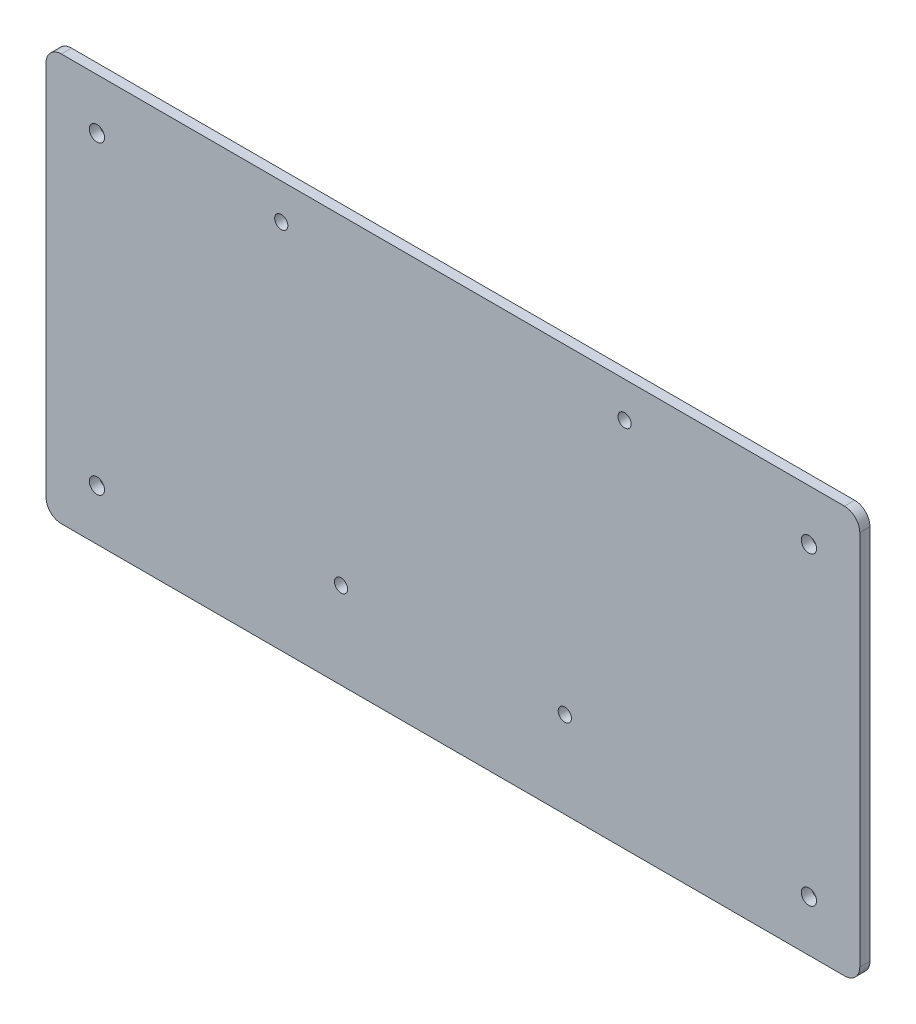
ISO-10303-21;
HEADER;
FILE_DESCRIPTION(('STEP AP214'),'2;1');
FILE_NAME('part.step','',(''),(''),'','','');
FILE_SCHEMA(('AUTOMOTIVE_DESIGN { 1 0 10303 214 1 1 1 1 }'));
ENDSEC;
DATA;
#1=APPLICATION_CONTEXT('core data for automotive mechanical design processes');
#2=APPLICATION_PROTOCOL_DEFINITION('international standard','automotive_design',2000,#1);
#3=PRODUCT_CONTEXT('',#1,'mechanical');
#4=PRODUCT('Part','Part','',(#3));
#5=PRODUCT_RELATED_PRODUCT_CATEGORY('part','',(#4));
#6=PRODUCT_DEFINITION_FORMATION('','',#4);
#7=PRODUCT_DEFINITION_CONTEXT('part definition',#1,'design');
#8=PRODUCT_DEFINITION('design','',#6,#7);
#9=PRODUCT_DEFINITION_SHAPE('','',#8);
#10=(LENGTH_UNIT() NAMED_UNIT(*) SI_UNIT(.MILLI.,.METRE.));
#11=(NAMED_UNIT(*) PLANE_ANGLE_UNIT() SI_UNIT($,.RADIAN.));
#12=(NAMED_UNIT(*) SI_UNIT($,.STERADIAN.) SOLID_ANGLE_UNIT());
#13=UNCERTAINTY_MEASURE_WITH_UNIT(LENGTH_MEASURE(1.E-05),#10,'distance_accuracy_value','');
#14=(GEOMETRIC_REPRESENTATION_CONTEXT(3) GLOBAL_UNCERTAINTY_ASSIGNED_CONTEXT((#13)) GLOBAL_UNIT_ASSIGNED_CONTEXT((#10,
#11,#12)) REPRESENTATION_CONTEXT('',''));
#15=CARTESIAN_POINT('',(0.,0.,0.));
#16=DIRECTION('',(0.,0.,1.));
#17=DIRECTION('',(1.,0.,0.));
#18=AXIS2_PLACEMENT_3D('',#15,#16,#17);
#19=CARTESIAN_POINT('',(-80.,-40.,2.));
#20=DIRECTION('',(0.,1.,0.));
#21=DIRECTION('',(0.,0.,1.));
#22=AXIS2_PLACEMENT_3D('',#19,#20,#21);
#23=PLANE('',#22);
#24=DIRECTION('',(1.,0.,0.));
#25=VECTOR('',#24,1.);
#26=CARTESIAN_POINT('',(-80.,-40.,0.));
#27=LINE('',#26,#25);
#28=CARTESIAN_POINT('',(-77.,-40.,0.));
#29=VERTEX_POINT('',#28);
#30=CARTESIAN_POINT('',(77.,-40.,0.));
#31=VERTEX_POINT('',#30);
#32=EDGE_CURVE('E127',#29,#31,#27,.T.);
#33=ORIENTED_EDGE('',*,*,#32,.T.);
#34=DIRECTION('',(0.,0.,-1.));
#35=VECTOR('',#34,1.);
#36=CARTESIAN_POINT('',(77.,-40.,2.));
#37=LINE('',#36,#35);
#38=CARTESIAN_POINT('',(77.,-40.,2.));
#39=VERTEX_POINT('',#38);
#40=EDGE_CURVE('E150',#31,#39,#37,.F.);
#41=ORIENTED_EDGE('',*,*,#40,.T.);
#42=DIRECTION('',(1.,0.,0.));
#43=VECTOR('',#42,1.);
#44=CARTESIAN_POINT('',(-80.,-40.,2.));
#45=LINE('',#44,#43);
#46=CARTESIAN_POINT('',(-77.,-40.,2.));
#47=VERTEX_POINT('',#46);
#48=EDGE_CURVE('E173',#47,#39,#45,.T.);
#49=ORIENTED_EDGE('',*,*,#48,.F.);
#50=DIRECTION('',(0.,0.,-1.));
#51=VECTOR('',#50,1.);
#52=CARTESIAN_POINT('',(-77.,-40.,2.));
#53=LINE('',#52,#51);
#54=EDGE_CURVE('E148',#47,#29,#53,.T.);
#55=ORIENTED_EDGE('',*,*,#54,.T.);
#56=EDGE_LOOP('',(#33,#41,#49,#55));
#57=FACE_BOUND('',#56,.T.);
#58=ADVANCED_FACE('F41',(#57),#23,.F.);
#59=CARTESIAN_POINT('',(80.,40.,2.));
#60=DIRECTION('',(1.,0.,0.));
#61=DIRECTION('',(0.,1.,0.));
#62=AXIS2_PLACEMENT_3D('',#59,#60,#61);
#63=PLANE('',#62);
#64=DIRECTION('',(0.,-1.,0.));
#65=VECTOR('',#64,1.);
#66=CARTESIAN_POINT('',(80.,40.,2.));
#67=LINE('',#66,#65);
#68=CARTESIAN_POINT('',(80.,37.,2.));
#69=VERTEX_POINT('',#68);
#70=CARTESIAN_POINT('',(80.,-37.,2.));
#71=VERTEX_POINT('',#70);
#72=EDGE_CURVE('E170',#69,#71,#67,.T.);
#73=ORIENTED_EDGE('',*,*,#72,.T.);
#74=DIRECTION('',(0.,0.,-1.));
#75=VECTOR('',#74,1.);
#76=CARTESIAN_POINT('',(80.,-37.,0.));
#77=LINE('',#76,#75);
#78=CARTESIAN_POINT('',(80.,-37.,0.));
#79=VERTEX_POINT('',#78);
#80=EDGE_CURVE('E129',#71,#79,#77,.T.);
#81=ORIENTED_EDGE('',*,*,#80,.T.);
#82=DIRECTION('',(0.,-1.,0.));
#83=VECTOR('',#82,1.);
#84=CARTESIAN_POINT('',(80.,40.,0.));
#85=LINE('',#84,#83);
#86=CARTESIAN_POINT('',(80.,37.,0.));
#87=VERTEX_POINT('',#86);
#88=EDGE_CURVE('E111',#87,#79,#85,.T.);
#89=ORIENTED_EDGE('',*,*,#88,.F.);
#90=DIRECTION('',(0.,0.,-1.));
#91=VECTOR('',#90,1.);
#92=CARTESIAN_POINT('',(80.,37.,2.));
#93=LINE('',#92,#91);
#94=EDGE_CURVE('E121',#87,#69,#93,.F.);
#95=ORIENTED_EDGE('',*,*,#94,.T.);
#96=EDGE_LOOP('',(#73,#81,#89,#95));
#97=FACE_BOUND('',#96,.T.);
#98=ADVANCED_FACE('F124',(#97),#63,.T.);
#99=CARTESIAN_POINT('',(-80.,40.,2.));
#100=DIRECTION('',(0.,1.,0.));
#101=DIRECTION('',(0.,0.,1.));
#102=AXIS2_PLACEMENT_3D('',#99,#100,#101);
#103=PLANE('',#102);
#104=DIRECTION('',(1.,0.,0.));
#105=VECTOR('',#104,1.);
#106=CARTESIAN_POINT('',(-80.,40.,2.));
#107=LINE('',#106,#105);
#108=CARTESIAN_POINT('',(-77.,40.,2.));
#109=VERTEX_POINT('',#108);
#110=CARTESIAN_POINT('',(77.,40.,2.));
#111=VERTEX_POINT('',#110);
#112=EDGE_CURVE('E136',#109,#111,#107,.T.);
#113=ORIENTED_EDGE('',*,*,#112,.T.);
#114=DIRECTION('',(0.,0.,-1.));
#115=VECTOR('',#114,1.);
#116=CARTESIAN_POINT('',(77.,40.,2.));
#117=LINE('',#116,#115);
#118=CARTESIAN_POINT('',(77.,40.,0.));
#119=VERTEX_POINT('',#118);
#120=EDGE_CURVE('E11',#111,#119,#117,.T.);
#121=ORIENTED_EDGE('',*,*,#120,.T.);
#122=DIRECTION('',(1.,0.,0.));
#123=VECTOR('',#122,1.);
#124=CARTESIAN_POINT('',(-80.,40.,0.));
#125=LINE('',#124,#123);
#126=CARTESIAN_POINT('',(-77.,40.,0.));
#127=VERTEX_POINT('',#126);
#128=EDGE_CURVE('E113',#127,#119,#125,.T.);
#129=ORIENTED_EDGE('',*,*,#128,.F.);
#130=DIRECTION('',(0.,0.,-1.));
#131=VECTOR('',#130,1.);
#132=CARTESIAN_POINT('',(-77.,40.,2.));
#133=LINE('',#132,#131);
#134=EDGE_CURVE('E47',#127,#109,#133,.F.);
#135=ORIENTED_EDGE('',*,*,#134,.T.);
#136=EDGE_LOOP('',(#113,#121,#129,#135));
#137=FACE_BOUND('',#136,.T.);
#138=ADVANCED_FACE('F161',(#137),#103,.T.);
#139=CARTESIAN_POINT('',(-80.,40.,2.));
#140=DIRECTION('',(1.,0.,0.));
#141=DIRECTION('',(0.,1.,0.));
#142=AXIS2_PLACEMENT_3D('',#139,#140,#141);
#143=PLANE('',#142);
#144=DIRECTION('',(0.,-1.,0.));
#145=VECTOR('',#144,1.);
#146=CARTESIAN_POINT('',(-80.,40.,0.));
#147=LINE('',#146,#145);
#148=CARTESIAN_POINT('',(-80.,37.,0.));
#149=VERTEX_POINT('',#148);
#150=CARTESIAN_POINT('',(-80.,-37.,0.));
#151=VERTEX_POINT('',#150);
#152=EDGE_CURVE('E138',#149,#151,#147,.T.);
#153=ORIENTED_EDGE('',*,*,#152,.T.);
#154=DIRECTION('',(0.,0.,-1.));
#155=VECTOR('',#154,1.);
#156=CARTESIAN_POINT('',(-80.,-37.,2.));
#157=LINE('',#156,#155);
#158=CARTESIAN_POINT('',(-80.,-37.,2.));
#159=VERTEX_POINT('',#158);
#160=EDGE_CURVE('E57',#151,#159,#157,.F.);
#161=ORIENTED_EDGE('',*,*,#160,.T.);
#162=DIRECTION('',(0.,-1.,0.));
#163=VECTOR('',#162,1.);
#164=CARTESIAN_POINT('',(-80.,40.,2.));
#165=LINE('',#164,#163);
#166=CARTESIAN_POINT('',(-80.,37.,2.));
#167=VERTEX_POINT('',#166);
#168=EDGE_CURVE('E134',#167,#159,#165,.T.);
#169=ORIENTED_EDGE('',*,*,#168,.F.);
#170=DIRECTION('',(0.,0.,-1.));
#171=VECTOR('',#170,1.);
#172=CARTESIAN_POINT('',(-80.,37.,0.));
#173=LINE('',#172,#171);
#174=EDGE_CURVE('E157',#167,#149,#173,.T.);
#175=ORIENTED_EDGE('',*,*,#174,.T.);
#176=EDGE_LOOP('',(#153,#161,#169,#175));
#177=FACE_BOUND('',#176,.T.);
#178=ADVANCED_FACE('F171',(#177),#143,.F.);
#179=CARTESIAN_POINT('',(0.,0.,2.));
#180=DIRECTION('',(0.,0.,-1.));
#181=DIRECTION('',(-1.,0.,0.));
#182=AXIS2_PLACEMENT_3D('',#179,#180,#181);
#183=PLANE('',#182);
#184=CARTESIAN_POINT('',(-69.9999999999987,-30.0000000000002,2.));
#185=DIRECTION('',(0.,0.,-1.));
#186=DIRECTION('',(-1.,0.,0.));
#187=AXIS2_PLACEMENT_3D('',#184,#185,#186);
#188=CIRCLE('',#187,1.49999999999995);
#189=CARTESIAN_POINT('',(-71.4999999999987,-30.0000000000002,2.));
#190=VERTEX_POINT('',#189);
#191=EDGE_CURVE('E208',#190,#190,#188,.T.);
#192=ORIENTED_EDGE('',*,*,#191,.T.);
#193=EDGE_LOOP('',(#192));
#194=FACE_BOUND('',#193,.T.);
#195=CARTESIAN_POINT('',(-69.9999999999988,29.9999999999996,2.));
#196=DIRECTION('',(0.,0.,-1.));
#197=DIRECTION('',(-1.,0.,0.));
#198=AXIS2_PLACEMENT_3D('',#195,#196,#197);
#199=CIRCLE('',#198,1.50000000000004);
#200=CARTESIAN_POINT('',(-71.4999999999988,29.9999999999996,2.));
#201=VERTEX_POINT('',#200);
#202=EDGE_CURVE('E216',#201,#201,#199,.T.);
#203=ORIENTED_EDGE('',*,*,#202,.T.);
#204=EDGE_LOOP('',(#203));
#205=FACE_BOUND('',#204,.T.);
#206=CARTESIAN_POINT('',(69.9999999999977,30.0000000000029,2.));
#207=DIRECTION('',(0.,0.,-1.));
#208=DIRECTION('',(-1.,0.,0.));
#209=AXIS2_PLACEMENT_3D('',#206,#207,#208);
#210=CIRCLE('',#209,1.49999999999992);
#211=CARTESIAN_POINT('',(68.4999999999978,30.0000000000029,2.));
#212=VERTEX_POINT('',#211);
#213=EDGE_CURVE('E222',#212,#212,#210,.T.);
#214=ORIENTED_EDGE('',*,*,#213,.T.);
#215=EDGE_LOOP('',(#214));
#216=FACE_BOUND('',#215,.T.);
#217=CARTESIAN_POINT('',(69.9999999999977,-29.9999999999974,2.));
#218=DIRECTION('',(0.,0.,-1.));
#219=DIRECTION('',(-1.,0.,0.));
#220=AXIS2_PLACEMENT_3D('',#217,#218,#219);
#221=CIRCLE('',#220,1.49999999999994);
#222=CARTESIAN_POINT('',(68.4999999999978,-29.9999999999974,2.));
#223=VERTEX_POINT('',#222);
#224=EDGE_CURVE('E197',#223,#223,#221,.T.);
#225=ORIENTED_EDGE('',*,*,#224,.T.);
#226=EDGE_LOOP('',(#225));
#227=FACE_BOUND('',#226,.T.);
#228=CARTESIAN_POINT('',(-33.75,33.,2.));
#229=DIRECTION('',(0.,0.,1.));
#230=DIRECTION('',(1.,0.,0.));
#231=AXIS2_PLACEMENT_3D('',#228,#229,#230);
#232=CIRCLE('',#231,1.29999999999999);
#233=CARTESIAN_POINT('',(-32.45,33.,2.));
#234=VERTEX_POINT('',#233);
#235=EDGE_CURVE('E192',#234,#234,#232,.T.);
#236=ORIENTED_EDGE('',*,*,#235,.F.);
#237=EDGE_LOOP('',(#236));
#238=FACE_BOUND('',#237,.T.);
#239=CARTESIAN_POINT('',(22.,-23.,2.));
#240=DIRECTION('',(0.,0.,1.));
#241=DIRECTION('',(1.,0.,0.));
#242=AXIS2_PLACEMENT_3D('',#239,#240,#241);
#243=CIRCLE('',#242,1.29999999999998);
#244=CARTESIAN_POINT('',(23.3,-23.,2.));
#245=VERTEX_POINT('',#244);
#246=EDGE_CURVE('E183',#245,#245,#243,.T.);
#247=ORIENTED_EDGE('',*,*,#246,.F.);
#248=EDGE_LOOP('',(#247));
#249=FACE_BOUND('',#248,.T.);
#250=CARTESIAN_POINT('',(-22.,-23.,2.));
#251=DIRECTION('',(0.,0.,1.));
#252=DIRECTION('',(1.,0.,0.));
#253=AXIS2_PLACEMENT_3D('',#250,#251,#252);
#254=CIRCLE('',#253,1.29999999999998);
#255=CARTESIAN_POINT('',(-20.7,-23.,2.));
#256=VERTEX_POINT('',#255);
#257=EDGE_CURVE('E182',#256,#256,#254,.T.);
#258=ORIENTED_EDGE('',*,*,#257,.F.);
#259=EDGE_LOOP('',(#258));
#260=FACE_BOUND('',#259,.T.);
#261=CARTESIAN_POINT('',(33.75,33.,2.));
#262=DIRECTION('',(0.,0.,1.));
#263=DIRECTION('',(1.,0.,0.));
#264=AXIS2_PLACEMENT_3D('',#261,#262,#263);
#265=CIRCLE('',#264,1.29999999999999);
#266=CARTESIAN_POINT('',(35.05,33.,2.));
#267=VERTEX_POINT('',#266);
#268=EDGE_CURVE('E188',#267,#267,#265,.T.);
#269=ORIENTED_EDGE('',*,*,#268,.F.);
#270=EDGE_LOOP('',(#269));
#271=FACE_BOUND('',#270,.T.);
#272=ORIENTED_EDGE('',*,*,#48,.T.);
#273=CARTESIAN_POINT('',(77.,-37.,2.));
#274=DIRECTION('',(0.,0.,-1.));
#275=DIRECTION('',(-1.,0.,0.));
#276=AXIS2_PLACEMENT_3D('',#273,#274,#275);
#277=CIRCLE('',#276,3.);
#278=EDGE_CURVE('E155',#39,#71,#277,.F.);
#279=ORIENTED_EDGE('',*,*,#278,.T.);
#280=ORIENTED_EDGE('',*,*,#72,.F.);
#281=CARTESIAN_POINT('',(77.,37.,2.));
#282=DIRECTION('',(0.,0.,-1.));
#283=DIRECTION('',(-1.,0.,0.));
#284=AXIS2_PLACEMENT_3D('',#281,#282,#283);
#285=CIRCLE('',#284,3.);
#286=EDGE_CURVE('E132',#69,#111,#285,.F.);
#287=ORIENTED_EDGE('',*,*,#286,.T.);
#288=ORIENTED_EDGE('',*,*,#112,.F.);
#289=CARTESIAN_POINT('',(-77.,37.,2.));
#290=DIRECTION('',(0.,0.,-1.));
#291=DIRECTION('',(-1.,0.,0.));
#292=AXIS2_PLACEMENT_3D('',#289,#290,#291);
#293=CIRCLE('',#292,3.);
#294=EDGE_CURVE('E62',#109,#167,#293,.F.);
#295=ORIENTED_EDGE('',*,*,#294,.T.);
#296=ORIENTED_EDGE('',*,*,#168,.T.);
#297=CARTESIAN_POINT('',(-77.,-37.,2.));
#298=DIRECTION('',(0.,0.,-1.));
#299=DIRECTION('',(-1.,0.,0.));
#300=AXIS2_PLACEMENT_3D('',#297,#298,#299);
#301=CIRCLE('',#300,3.);
#302=EDGE_CURVE('E154',#159,#47,#301,.F.);
#303=ORIENTED_EDGE('',*,*,#302,.T.);
#304=EDGE_LOOP('',(#272,#279,#280,#287,#288,#295,#296,#303));
#305=FACE_BOUND('',#304,.T.);
#306=ADVANCED_FACE('F168',(#194,#205,#216,#227,#238,#249,#260,#271,#305),#183,.F.);
#307=CARTESIAN_POINT('',(0.,0.,0.));
#308=DIRECTION('',(0.,0.,-1.));
#309=DIRECTION('',(-1.,0.,0.));
#310=AXIS2_PLACEMENT_3D('',#307,#308,#309);
#311=PLANE('',#310);
#312=CARTESIAN_POINT('',(-69.9999999999987,-30.0000000000002,0.));
#313=DIRECTION('',(0.,0.,-1.));
#314=DIRECTION('',(-1.,0.,0.));
#315=AXIS2_PLACEMENT_3D('',#312,#313,#314);
#316=CIRCLE('',#315,1.49999999999995);
#317=CARTESIAN_POINT('',(-71.4999999999987,-30.0000000000002,0.));
#318=VERTEX_POINT('',#317);
#319=EDGE_CURVE('E212',#318,#318,#316,.T.);
#320=ORIENTED_EDGE('',*,*,#319,.F.);
#321=EDGE_LOOP('',(#320));
#322=FACE_BOUND('',#321,.T.);
#323=CARTESIAN_POINT('',(-69.9999999999988,29.9999999999996,0.));
#324=DIRECTION('',(0.,0.,-1.));
#325=DIRECTION('',(-1.,0.,0.));
#326=AXIS2_PLACEMENT_3D('',#323,#324,#325);
#327=CIRCLE('',#326,1.50000000000004);
#328=CARTESIAN_POINT('',(-71.4999999999988,29.9999999999996,0.));
#329=VERTEX_POINT('',#328);
#330=EDGE_CURVE('E218',#329,#329,#327,.T.);
#331=ORIENTED_EDGE('',*,*,#330,.F.);
#332=EDGE_LOOP('',(#331));
#333=FACE_BOUND('',#332,.T.);
#334=CARTESIAN_POINT('',(69.9999999999977,30.0000000000029,0.));
#335=DIRECTION('',(0.,0.,-1.));
#336=DIRECTION('',(-1.,0.,0.));
#337=AXIS2_PLACEMENT_3D('',#334,#335,#336);
#338=CIRCLE('',#337,1.49999999999992);
#339=CARTESIAN_POINT('',(68.4999999999978,30.0000000000029,0.));
#340=VERTEX_POINT('',#339);
#341=EDGE_CURVE('E210',#340,#340,#338,.T.);
#342=ORIENTED_EDGE('',*,*,#341,.F.);
#343=EDGE_LOOP('',(#342));
#344=FACE_BOUND('',#343,.T.);
#345=CARTESIAN_POINT('',(69.9999999999977,-29.9999999999974,0.));
#346=DIRECTION('',(0.,0.,-1.));
#347=DIRECTION('',(-1.,0.,0.));
#348=AXIS2_PLACEMENT_3D('',#345,#346,#347);
#349=CIRCLE('',#348,1.49999999999994);
#350=CARTESIAN_POINT('',(68.4999999999978,-29.9999999999974,0.));
#351=VERTEX_POINT('',#350);
#352=EDGE_CURVE('E203',#351,#351,#349,.T.);
#353=ORIENTED_EDGE('',*,*,#352,.F.);
#354=EDGE_LOOP('',(#353));
#355=FACE_BOUND('',#354,.T.);
#356=CARTESIAN_POINT('',(-33.75,33.,0.));
#357=DIRECTION('',(0.,0.,1.));
#358=DIRECTION('',(1.,0.,0.));
#359=AXIS2_PLACEMENT_3D('',#356,#357,#358);
#360=CIRCLE('',#359,1.29999999999999);
#361=CARTESIAN_POINT('',(-32.45,33.,0.));
#362=VERTEX_POINT('',#361);
#363=EDGE_CURVE('E180',#362,#362,#360,.T.);
#364=ORIENTED_EDGE('',*,*,#363,.T.);
#365=EDGE_LOOP('',(#364));
#366=FACE_BOUND('',#365,.T.);
#367=CARTESIAN_POINT('',(22.,-23.,0.));
#368=DIRECTION('',(0.,0.,1.));
#369=DIRECTION('',(1.,0.,0.));
#370=AXIS2_PLACEMENT_3D('',#367,#368,#369);
#371=CIRCLE('',#370,1.29999999999998);
#372=CARTESIAN_POINT('',(23.3,-23.,0.));
#373=VERTEX_POINT('',#372);
#374=EDGE_CURVE('E195',#373,#373,#371,.T.);
#375=ORIENTED_EDGE('',*,*,#374,.T.);
#376=EDGE_LOOP('',(#375));
#377=FACE_BOUND('',#376,.T.);
#378=CARTESIAN_POINT('',(-22.,-23.,0.));
#379=DIRECTION('',(0.,0.,1.));
#380=DIRECTION('',(1.,0.,0.));
#381=AXIS2_PLACEMENT_3D('',#378,#379,#380);
#382=CIRCLE('',#381,1.29999999999998);
#383=CARTESIAN_POINT('',(-20.7,-23.,0.));
#384=VERTEX_POINT('',#383);
#385=EDGE_CURVE('E179',#384,#384,#382,.T.);
#386=ORIENTED_EDGE('',*,*,#385,.T.);
#387=EDGE_LOOP('',(#386));
#388=FACE_BOUND('',#387,.T.);
#389=CARTESIAN_POINT('',(33.75,33.,0.));
#390=DIRECTION('',(0.,0.,1.));
#391=DIRECTION('',(1.,0.,0.));
#392=AXIS2_PLACEMENT_3D('',#389,#390,#391);
#393=CIRCLE('',#392,1.29999999999999);
#394=CARTESIAN_POINT('',(35.05,33.,0.));
#395=VERTEX_POINT('',#394);
#396=EDGE_CURVE('E190',#395,#395,#393,.T.);
#397=ORIENTED_EDGE('',*,*,#396,.T.);
#398=EDGE_LOOP('',(#397));
#399=FACE_BOUND('',#398,.T.);
#400=ORIENTED_EDGE('',*,*,#88,.T.);
#401=CARTESIAN_POINT('',(77.,-37.,0.));
#402=DIRECTION('',(0.,0.,-1.));
#403=DIRECTION('',(-1.,0.,0.));
#404=AXIS2_PLACEMENT_3D('',#401,#402,#403);
#405=CIRCLE('',#404,3.);
#406=EDGE_CURVE('E144',#79,#31,#405,.T.);
#407=ORIENTED_EDGE('',*,*,#406,.T.);
#408=ORIENTED_EDGE('',*,*,#32,.F.);
#409=CARTESIAN_POINT('',(-77.,-37.,0.));
#410=DIRECTION('',(0.,0.,-1.));
#411=DIRECTION('',(-1.,0.,0.));
#412=AXIS2_PLACEMENT_3D('',#409,#410,#411);
#413=CIRCLE('',#412,3.);
#414=EDGE_CURVE('E120',#29,#151,#413,.T.);
#415=ORIENTED_EDGE('',*,*,#414,.T.);
#416=ORIENTED_EDGE('',*,*,#152,.F.);
#417=CARTESIAN_POINT('',(-77.,37.,0.));
#418=DIRECTION('',(0.,0.,-1.));
#419=DIRECTION('',(-1.,0.,0.));
#420=AXIS2_PLACEMENT_3D('',#417,#418,#419);
#421=CIRCLE('',#420,3.);
#422=EDGE_CURVE('E117',#149,#127,#421,.T.);
#423=ORIENTED_EDGE('',*,*,#422,.T.);
#424=ORIENTED_EDGE('',*,*,#128,.T.);
#425=CARTESIAN_POINT('',(77.,37.,0.));
#426=DIRECTION('',(0.,0.,-1.));
#427=DIRECTION('',(-1.,0.,0.));
#428=AXIS2_PLACEMENT_3D('',#425,#426,#427);
#429=CIRCLE('',#428,3.);
#430=EDGE_CURVE('E108',#119,#87,#429,.T.);
#431=ORIENTED_EDGE('',*,*,#430,.T.);
#432=EDGE_LOOP('',(#400,#407,#408,#415,#416,#423,#424,#431));
#433=FACE_BOUND('',#432,.T.);
#434=ADVANCED_FACE('F109',(#322,#333,#344,#355,#366,#377,#388,#399,#433),#311,.T.);
#435=CARTESIAN_POINT('',(33.75,33.,0.));
#436=DIRECTION('',(0.,0.,1.));
#437=DIRECTION('',(1.,0.,0.));
#438=AXIS2_PLACEMENT_3D('',#435,#436,#437);
#439=CYLINDRICAL_SURFACE('',#438,1.29999999999999);
#440=ORIENTED_EDGE('',*,*,#396,.F.);
#441=EDGE_LOOP('',(#440));
#442=FACE_BOUND('',#441,.T.);
#443=ORIENTED_EDGE('',*,*,#268,.T.);
#444=EDGE_LOOP('',(#443));
#445=FACE_BOUND('',#444,.T.);
#446=ADVANCED_FACE('F235',(#442,#445),#439,.F.);
#447=CARTESIAN_POINT('',(-22.,-23.,0.));
#448=DIRECTION('',(0.,0.,1.));
#449=DIRECTION('',(1.,0.,0.));
#450=AXIS2_PLACEMENT_3D('',#447,#448,#449);
#451=CYLINDRICAL_SURFACE('',#450,1.29999999999998);
#452=ORIENTED_EDGE('',*,*,#385,.F.);
#453=EDGE_LOOP('',(#452));
#454=FACE_BOUND('',#453,.T.);
#455=ORIENTED_EDGE('',*,*,#257,.T.);
#456=EDGE_LOOP('',(#455));
#457=FACE_BOUND('',#456,.T.);
#458=ADVANCED_FACE('F250',(#454,#457),#451,.F.);
#459=CARTESIAN_POINT('',(22.,-23.,0.));
#460=DIRECTION('',(0.,0.,1.));
#461=DIRECTION('',(1.,0.,0.));
#462=AXIS2_PLACEMENT_3D('',#459,#460,#461);
#463=CYLINDRICAL_SURFACE('',#462,1.29999999999998);
#464=ORIENTED_EDGE('',*,*,#374,.F.);
#465=EDGE_LOOP('',(#464));
#466=FACE_BOUND('',#465,.T.);
#467=ORIENTED_EDGE('',*,*,#246,.T.);
#468=EDGE_LOOP('',(#467));
#469=FACE_BOUND('',#468,.T.);
#470=ADVANCED_FACE('F349',(#466,#469),#463,.F.);
#471=CARTESIAN_POINT('',(-33.75,33.,0.));
#472=DIRECTION('',(0.,0.,1.));
#473=DIRECTION('',(1.,0.,0.));
#474=AXIS2_PLACEMENT_3D('',#471,#472,#473);
#475=CYLINDRICAL_SURFACE('',#474,1.29999999999999);
#476=ORIENTED_EDGE('',*,*,#363,.F.);
#477=EDGE_LOOP('',(#476));
#478=FACE_BOUND('',#477,.T.);
#479=ORIENTED_EDGE('',*,*,#235,.T.);
#480=EDGE_LOOP('',(#479));
#481=FACE_BOUND('',#480,.T.);
#482=ADVANCED_FACE('F336',(#478,#481),#475,.F.);
#483=CARTESIAN_POINT('',(69.9999999999977,-29.9999999999974,2.));
#484=DIRECTION('',(0.,0.,-1.));
#485=DIRECTION('',(-1.,0.,0.));
#486=AXIS2_PLACEMENT_3D('',#483,#484,#485);
#487=CYLINDRICAL_SURFACE('',#486,1.49999999999994);
#488=ORIENTED_EDGE('',*,*,#224,.F.);
#489=EDGE_LOOP('',(#488));
#490=FACE_BOUND('',#489,.T.);
#491=ORIENTED_EDGE('',*,*,#352,.T.);
#492=EDGE_LOOP('',(#491));
#493=FACE_BOUND('',#492,.T.);
#494=ADVANCED_FACE('F329',(#490,#493),#487,.F.);
#495=CARTESIAN_POINT('',(69.9999999999977,30.0000000000029,2.));
#496=DIRECTION('',(0.,0.,-1.));
#497=DIRECTION('',(-1.,0.,0.));
#498=AXIS2_PLACEMENT_3D('',#495,#496,#497);
#499=CYLINDRICAL_SURFACE('',#498,1.49999999999992);
#500=ORIENTED_EDGE('',*,*,#213,.F.);
#501=EDGE_LOOP('',(#500));
#502=FACE_BOUND('',#501,.T.);
#503=ORIENTED_EDGE('',*,*,#341,.T.);
#504=EDGE_LOOP('',(#503));
#505=FACE_BOUND('',#504,.T.);
#506=ADVANCED_FACE('F226',(#502,#505),#499,.F.);
#507=CARTESIAN_POINT('',(-69.9999999999988,29.9999999999996,2.));
#508=DIRECTION('',(0.,0.,-1.));
#509=DIRECTION('',(-1.,0.,0.));
#510=AXIS2_PLACEMENT_3D('',#507,#508,#509);
#511=CYLINDRICAL_SURFACE('',#510,1.50000000000004);
#512=ORIENTED_EDGE('',*,*,#202,.F.);
#513=EDGE_LOOP('',(#512));
#514=FACE_BOUND('',#513,.T.);
#515=ORIENTED_EDGE('',*,*,#330,.T.);
#516=EDGE_LOOP('',(#515));
#517=FACE_BOUND('',#516,.T.);
#518=ADVANCED_FACE('F307',(#514,#517),#511,.F.);
#519=CARTESIAN_POINT('',(-69.9999999999987,-30.0000000000002,2.));
#520=DIRECTION('',(0.,0.,-1.));
#521=DIRECTION('',(-1.,0.,0.));
#522=AXIS2_PLACEMENT_3D('',#519,#520,#521);
#523=CYLINDRICAL_SURFACE('',#522,1.49999999999995);
#524=ORIENTED_EDGE('',*,*,#191,.F.);
#525=EDGE_LOOP('',(#524));
#526=FACE_BOUND('',#525,.T.);
#527=ORIENTED_EDGE('',*,*,#319,.T.);
#528=EDGE_LOOP('',(#527));
#529=FACE_BOUND('',#528,.T.);
#530=ADVANCED_FACE('F274',(#526,#529),#523,.F.);
#531=CARTESIAN_POINT('',(77.,-37.,2.));
#532=DIRECTION('',(0.,0.,1.));
#533=DIRECTION('',(1.,0.,0.));
#534=AXIS2_PLACEMENT_3D('',#531,#532,#533);
#535=CYLINDRICAL_SURFACE('',#534,3.);
#536=ORIENTED_EDGE('',*,*,#278,.F.);
#537=ORIENTED_EDGE('',*,*,#40,.F.);
#538=ORIENTED_EDGE('',*,*,#406,.F.);
#539=ORIENTED_EDGE('',*,*,#80,.F.);
#540=EDGE_LOOP('',(#536,#537,#538,#539));
#541=FACE_BOUND('',#540,.T.);
#542=ADVANCED_FACE('F270',(#541),#535,.T.);
#543=CARTESIAN_POINT('',(-77.,-37.,2.));
#544=DIRECTION('',(0.,0.,-1.));
#545=DIRECTION('',(-1.,0.,0.));
#546=AXIS2_PLACEMENT_3D('',#543,#544,#545);
#547=CYLINDRICAL_SURFACE('',#546,3.);
#548=ORIENTED_EDGE('',*,*,#302,.F.);
#549=ORIENTED_EDGE('',*,*,#160,.F.);
#550=ORIENTED_EDGE('',*,*,#414,.F.);
#551=ORIENTED_EDGE('',*,*,#54,.F.);
#552=EDGE_LOOP('',(#548,#549,#550,#551));
#553=FACE_BOUND('',#552,.T.);
#554=ADVANCED_FACE('F271',(#553),#547,.T.);
#555=CARTESIAN_POINT('',(77.,37.,2.));
#556=DIRECTION('',(0.,0.,-1.));
#557=DIRECTION('',(-1.,0.,0.));
#558=AXIS2_PLACEMENT_3D('',#555,#556,#557);
#559=CYLINDRICAL_SURFACE('',#558,3.);
#560=ORIENTED_EDGE('',*,*,#286,.F.);
#561=ORIENTED_EDGE('',*,*,#94,.F.);
#562=ORIENTED_EDGE('',*,*,#430,.F.);
#563=ORIENTED_EDGE('',*,*,#120,.F.);
#564=EDGE_LOOP('',(#560,#561,#562,#563));
#565=FACE_BOUND('',#564,.T.);
#566=ADVANCED_FACE('F131',(#565),#559,.T.);
#567=CARTESIAN_POINT('',(-77.,37.,2.));
#568=DIRECTION('',(0.,0.,1.));
#569=DIRECTION('',(1.,0.,0.));
#570=AXIS2_PLACEMENT_3D('',#567,#568,#569);
#571=CYLINDRICAL_SURFACE('',#570,3.);
#572=ORIENTED_EDGE('',*,*,#294,.F.);
#573=ORIENTED_EDGE('',*,*,#134,.F.);
#574=ORIENTED_EDGE('',*,*,#422,.F.);
#575=ORIENTED_EDGE('',*,*,#174,.F.);
#576=EDGE_LOOP('',(#572,#573,#574,#575));
#577=FACE_BOUND('',#576,.T.);
#578=ADVANCED_FACE('F43',(#577),#571,.T.);
#579=CLOSED_SHELL('',(#58,#98,#138,#178,#306,#434,#446,#458,#470,#482,#494,#506,#518,#530,#542,
#554,#566,#578));
#580=MANIFOLD_SOLID_BREP('B2',#579);
#581=ADVANCED_BREP_SHAPE_REPRESENTATION('',(#18,#580),#14);
#582=SHAPE_DEFINITION_REPRESENTATION(#9,#581);
ENDSEC;
END-ISO-10303-21;
